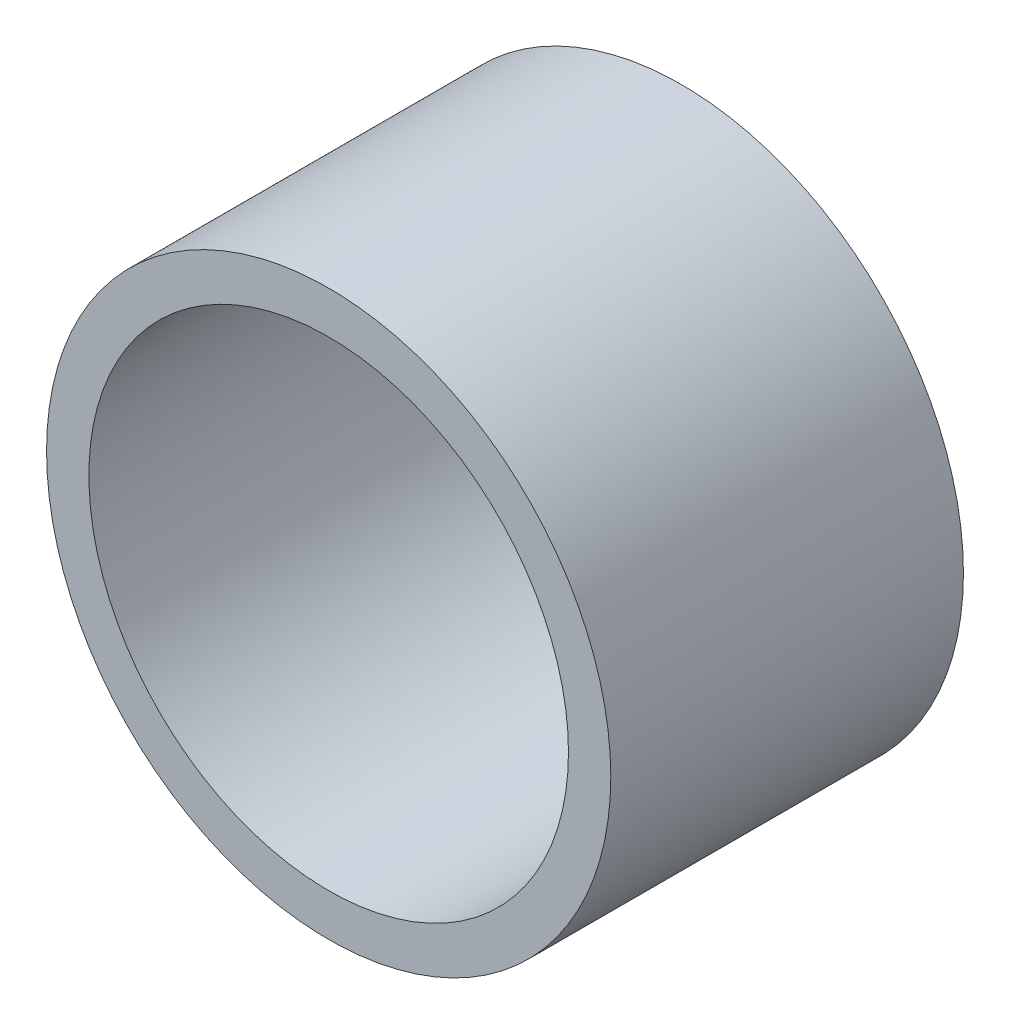
ISO-10303-21;
HEADER;
FILE_DESCRIPTION(('STEP AP214'),'2;1');
FILE_NAME('part.step','',(''),(''),'','','');
FILE_SCHEMA(('AUTOMOTIVE_DESIGN { 1 0 10303 214 1 1 1 1 }'));
ENDSEC;
DATA;
#1=APPLICATION_CONTEXT('core data for automotive mechanical design processes');
#2=APPLICATION_PROTOCOL_DEFINITION('international standard','automotive_design',2000,#1);
#3=PRODUCT_CONTEXT('',#1,'mechanical');
#4=PRODUCT('Part','Part','',(#3));
#5=PRODUCT_RELATED_PRODUCT_CATEGORY('part','',(#4));
#6=PRODUCT_DEFINITION_FORMATION('','',#4);
#7=PRODUCT_DEFINITION_CONTEXT('part definition',#1,'design');
#8=PRODUCT_DEFINITION('design','',#6,#7);
#9=PRODUCT_DEFINITION_SHAPE('','',#8);
#10=(LENGTH_UNIT() NAMED_UNIT(*) SI_UNIT(.MILLI.,.METRE.));
#11=(NAMED_UNIT(*) PLANE_ANGLE_UNIT() SI_UNIT($,.RADIAN.));
#12=(NAMED_UNIT(*) SI_UNIT($,.STERADIAN.) SOLID_ANGLE_UNIT());
#13=UNCERTAINTY_MEASURE_WITH_UNIT(LENGTH_MEASURE(1.E-05),#10,'distance_accuracy_value','');
#14=(GEOMETRIC_REPRESENTATION_CONTEXT(3) GLOBAL_UNCERTAINTY_ASSIGNED_CONTEXT((#13)) GLOBAL_UNIT_ASSIGNED_CONTEXT((#10,
#11,#12)) REPRESENTATION_CONTEXT('',''));
#15=CARTESIAN_POINT('',(0.,0.,0.));
#16=DIRECTION('',(0.,0.,1.));
#17=DIRECTION('',(1.,0.,0.));
#18=AXIS2_PLACEMENT_3D('',#15,#16,#17);
#19=CARTESIAN_POINT('',(0.,0.,7.5));
#20=DIRECTION('',(0.,0.,1.));
#21=DIRECTION('',(1.,0.,0.));
#22=AXIS2_PLACEMENT_3D('',#19,#20,#21);
#23=PLANE('',#22);
#24=CARTESIAN_POINT('',(0.,0.,7.5));
#25=DIRECTION('',(0.,0.,1.));
#26=DIRECTION('',(1.,0.,0.));
#27=AXIS2_PLACEMENT_3D('',#24,#25,#26);
#28=CIRCLE('',#27,6.);
#29=CARTESIAN_POINT('',(6.,0.,7.5));
#30=VERTEX_POINT('',#29);
#31=EDGE_CURVE('E10',#30,#30,#28,.T.);
#32=ORIENTED_EDGE('',*,*,#31,.T.);
#33=EDGE_LOOP('',(#32));
#34=FACE_BOUND('',#33,.T.);
#35=CARTESIAN_POINT('',(0.,0.,7.5));
#36=DIRECTION('',(0.,0.,1.));
#37=DIRECTION('',(1.,0.,0.));
#38=AXIS2_PLACEMENT_3D('',#35,#36,#37);
#39=CIRCLE('',#38,5.1);
#40=CARTESIAN_POINT('',(5.1,0.,7.5));
#41=VERTEX_POINT('',#40);
#42=EDGE_CURVE('E56',#41,#41,#39,.T.);
#43=ORIENTED_EDGE('',*,*,#42,.F.);
#44=EDGE_LOOP('',(#43));
#45=FACE_BOUND('',#44,.T.);
#46=ADVANCED_FACE('F43',(#34,#45),#23,.T.);
#47=CARTESIAN_POINT('',(0.,0.,0.));
#48=DIRECTION('',(0.,0.,1.));
#49=DIRECTION('',(1.,0.,0.));
#50=AXIS2_PLACEMENT_3D('',#47,#48,#49);
#51=PLANE('',#50);
#52=CARTESIAN_POINT('',(0.,0.,0.));
#53=DIRECTION('',(0.,0.,1.));
#54=DIRECTION('',(1.,0.,0.));
#55=AXIS2_PLACEMENT_3D('',#52,#53,#54);
#56=CIRCLE('',#55,6.);
#57=CARTESIAN_POINT('',(6.,0.,0.));
#58=VERTEX_POINT('',#57);
#59=EDGE_CURVE('E47',#58,#58,#56,.T.);
#60=ORIENTED_EDGE('',*,*,#59,.F.);
#61=EDGE_LOOP('',(#60));
#62=FACE_BOUND('',#61,.T.);
#63=CARTESIAN_POINT('',(0.,0.,0.));
#64=DIRECTION('',(0.,0.,1.));
#65=DIRECTION('',(1.,0.,0.));
#66=AXIS2_PLACEMENT_3D('',#63,#64,#65);
#67=CIRCLE('',#66,5.1);
#68=CARTESIAN_POINT('',(5.1,0.,0.));
#69=VERTEX_POINT('',#68);
#70=EDGE_CURVE('E58',#69,#69,#67,.T.);
#71=ORIENTED_EDGE('',*,*,#70,.T.);
#72=EDGE_LOOP('',(#71));
#73=FACE_BOUND('',#72,.T.);
#74=ADVANCED_FACE('F70',(#62,#73),#51,.F.);
#75=CARTESIAN_POINT('',(0.,0.,7.5));
#76=DIRECTION('',(0.,0.,-1.));
#77=DIRECTION('',(-1.,0.,0.));
#78=AXIS2_PLACEMENT_3D('',#75,#76,#77);
#79=CYLINDRICAL_SURFACE('',#78,6.);
#80=ORIENTED_EDGE('',*,*,#31,.F.);
#81=EDGE_LOOP('',(#80));
#82=FACE_BOUND('',#81,.T.);
#83=ORIENTED_EDGE('',*,*,#59,.T.);
#84=EDGE_LOOP('',(#83));
#85=FACE_BOUND('',#84,.T.);
#86=ADVANCED_FACE('F45',(#82,#85),#79,.T.);
#87=CARTESIAN_POINT('',(0.,0.,7.5));
#88=DIRECTION('',(0.,0.,-1.));
#89=DIRECTION('',(-1.,0.,0.));
#90=AXIS2_PLACEMENT_3D('',#87,#88,#89);
#91=CYLINDRICAL_SURFACE('',#90,5.1);
#92=ORIENTED_EDGE('',*,*,#42,.T.);
#93=EDGE_LOOP('',(#92));
#94=FACE_BOUND('',#93,.T.);
#95=ORIENTED_EDGE('',*,*,#70,.F.);
#96=EDGE_LOOP('',(#95));
#97=FACE_BOUND('',#96,.T.);
#98=ADVANCED_FACE('F66',(#94,#97),#91,.F.);
#99=CLOSED_SHELL('',(#46,#74,#86,#98));
#100=MANIFOLD_SOLID_BREP('B2',#99);
#101=ADVANCED_BREP_SHAPE_REPRESENTATION('',(#18,#100),#14);
#102=SHAPE_DEFINITION_REPRESENTATION(#9,#101);
ENDSEC;
END-ISO-10303-21;
